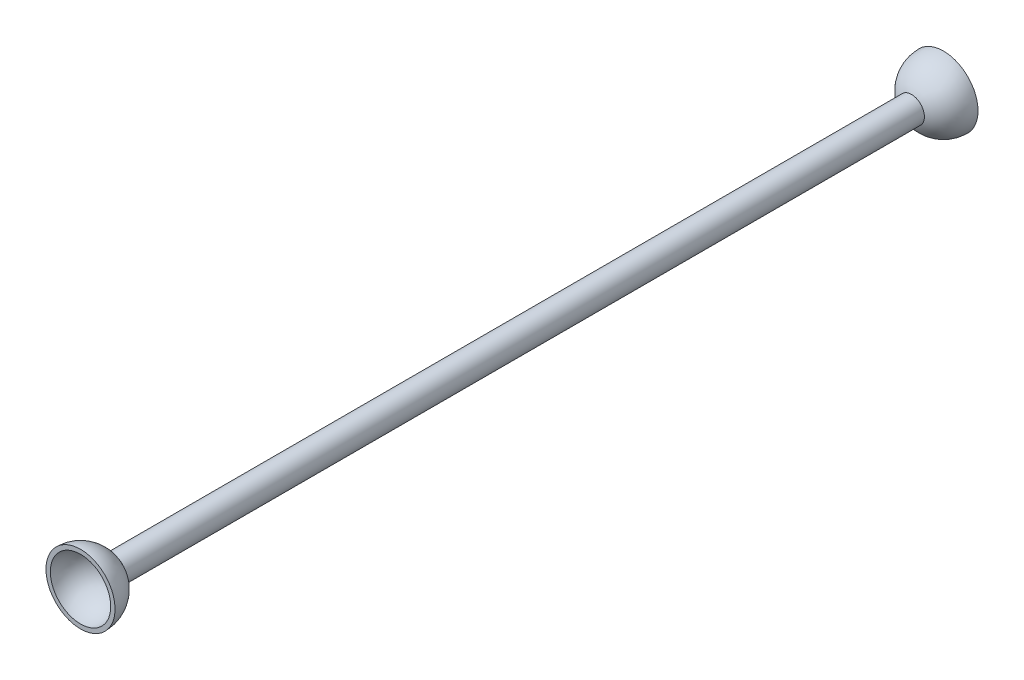
ISO-10303-21;
HEADER;
FILE_DESCRIPTION(('STEP AP214'),'2;1');
FILE_NAME('part.step','',(''),(''),'','','');
FILE_SCHEMA(('AUTOMOTIVE_DESIGN { 1 0 10303 214 1 1 1 1 }'));
ENDSEC;
DATA;
#1=APPLICATION_CONTEXT('core data for automotive mechanical design processes');
#2=APPLICATION_PROTOCOL_DEFINITION('international standard','automotive_design',2000,#1);
#3=PRODUCT_CONTEXT('',#1,'mechanical');
#4=PRODUCT('Part','Part','',(#3));
#5=PRODUCT_RELATED_PRODUCT_CATEGORY('part','',(#4));
#6=PRODUCT_DEFINITION_FORMATION('','',#4);
#7=PRODUCT_DEFINITION_CONTEXT('part definition',#1,'design');
#8=PRODUCT_DEFINITION('design','',#6,#7);
#9=PRODUCT_DEFINITION_SHAPE('','',#8);
#10=(LENGTH_UNIT() NAMED_UNIT(*) SI_UNIT(.MILLI.,.METRE.));
#11=(NAMED_UNIT(*) PLANE_ANGLE_UNIT() SI_UNIT($,.RADIAN.));
#12=(NAMED_UNIT(*) SI_UNIT($,.STERADIAN.) SOLID_ANGLE_UNIT());
#13=UNCERTAINTY_MEASURE_WITH_UNIT(LENGTH_MEASURE(1.E-05),#10,'distance_accuracy_value','');
#14=(GEOMETRIC_REPRESENTATION_CONTEXT(3) GLOBAL_UNCERTAINTY_ASSIGNED_CONTEXT((#13)) GLOBAL_UNIT_ASSIGNED_CONTEXT((#10,
#11,#12)) REPRESENTATION_CONTEXT('',''));
#15=CARTESIAN_POINT('',(0.,0.,0.));
#16=DIRECTION('',(0.,0.,1.));
#17=DIRECTION('',(1.,0.,0.));
#18=AXIS2_PLACEMENT_3D('',#15,#16,#17);
#19=CARTESIAN_POINT('',(0.,0.,200.));
#20=DIRECTION('',(0.,0.,-1.));
#21=DIRECTION('',(-1.,0.,0.));
#22=AXIS2_PLACEMENT_3D('',#19,#20,#21);
#23=CYLINDRICAL_SURFACE('',#22,3.);
#24=CARTESIAN_POINT('',(0.,0.,7.41619848709566));
#25=DIRECTION('',(0.,0.,-1.));
#26=DIRECTION('',(-1.,0.,0.));
#27=AXIS2_PLACEMENT_3D('',#24,#25,#26);
#28=CIRCLE('',#27,3.);
#29=CARTESIAN_POINT('',(-3.,0.,7.41619848709566));
#30=VERTEX_POINT('',#29);
#31=EDGE_CURVE('E48',#30,#30,#28,.F.);
#32=ORIENTED_EDGE('',*,*,#31,.T.);
#33=EDGE_LOOP('',(#32));
#34=FACE_BOUND('',#33,.T.);
#35=CARTESIAN_POINT('',(0.,0.,192.583801512904));
#36=DIRECTION('',(0.,0.,0.999999999999999));
#37=DIRECTION('',(1.,0.,0.));
#38=AXIS2_PLACEMENT_3D('',#35,#36,#37);
#39=CIRCLE('',#38,3.);
#40=CARTESIAN_POINT('',(3.,0.,192.583801512904));
#41=VERTEX_POINT('',#40);
#42=EDGE_CURVE('E10',#41,#41,#39,.F.);
#43=ORIENTED_EDGE('',*,*,#42,.T.);
#44=EDGE_LOOP('',(#43));
#45=FACE_BOUND('',#44,.T.);
#46=ADVANCED_FACE('F31',(#34,#45),#23,.T.);
#47=CARTESIAN_POINT('',(0.,0.,200.));
#48=DIRECTION('',(0.,-1.,0.));
#49=DIRECTION('',(1.,0.,0.));
#50=AXIS2_PLACEMENT_3D('',#47,#48,#49);
#51=SPHERICAL_SURFACE('',#50,8.);
#52=CARTESIAN_POINT('',(0.,0.,200.));
#53=DIRECTION('',(0.,0.,-1.));
#54=DIRECTION('',(-1.,0.,0.));
#55=AXIS2_PLACEMENT_3D('',#52,#53,#54);
#56=SPHERICAL_SURFACE('',#55,8.);
#57=CARTESIAN_POINT('',(0.,0.,200.));
#58=DIRECTION('',(0.,0.,-1.));
#59=DIRECTION('',(-1.,0.,0.));
#60=AXIS2_PLACEMENT_3D('',#57,#58,#59);
#61=CIRCLE('',#60,8.);
#62=CARTESIAN_POINT('',(-8.,0.,200.));
#63=VERTEX_POINT('',#62);
#64=EDGE_CURVE('E38',#63,#63,#61,.T.);
#65=ORIENTED_EDGE('',*,*,#64,.T.);
#66=EDGE_LOOP('',(#65));
#67=FACE_BOUND('',#66,.T.);
#68=ORIENTED_EDGE('',*,*,#42,.F.);
#69=EDGE_LOOP('',(#68));
#70=FACE_BOUND('',#69,.T.);
#71=ADVANCED_FACE('F74',(#67,#70),#56,.T.);
#72=CARTESIAN_POINT('',(0.,0.,200.));
#73=DIRECTION('',(0.,0.,1.));
#74=DIRECTION('',(1.,0.,0.));
#75=AXIS2_PLACEMENT_3D('',#72,#73,#74);
#76=PLANE('',#75);
#77=CARTESIAN_POINT('',(0.,0.,200.));
#78=DIRECTION('',(0.,0.,1.));
#79=DIRECTION('',(1.,0.,0.));
#80=AXIS2_PLACEMENT_3D('',#77,#78,#79);
#81=CIRCLE('',#80,7.);
#82=CARTESIAN_POINT('',(7.,0.,200.));
#83=VERTEX_POINT('',#82);
#84=EDGE_CURVE('E43',#83,#83,#81,.F.);
#85=ORIENTED_EDGE('',*,*,#84,.T.);
#86=EDGE_LOOP('',(#85));
#87=FACE_BOUND('',#86,.T.);
#88=ORIENTED_EDGE('',*,*,#64,.F.);
#89=EDGE_LOOP('',(#88));
#90=FACE_BOUND('',#89,.T.);
#91=ADVANCED_FACE('F78',(#87,#90),#76,.T.);
#92=CARTESIAN_POINT('',(0.,0.,200.));
#93=DIRECTION('',(0.,1.,0.));
#94=DIRECTION('',(1.,0.,0.));
#95=AXIS2_PLACEMENT_3D('',#92,#93,#94);
#96=SPHERICAL_SURFACE('',#95,7.);
#97=CARTESIAN_POINT('',(0.,0.,200.));
#98=DIRECTION('',(0.,0.,1.));
#99=DIRECTION('',(1.,0.,0.));
#100=AXIS2_PLACEMENT_3D('',#97,#98,#99);
#101=SPHERICAL_SURFACE('',#100,7.);
#102=ORIENTED_EDGE('',*,*,#84,.F.);
#103=EDGE_LOOP('',(#102));
#104=FACE_BOUND('',#103,.T.);
#105=ADVANCED_FACE('F70',(#104),#101,.F.);
#106=CARTESIAN_POINT('',(0.,0.,0.));
#107=DIRECTION('',(0.,-1.,0.));
#108=DIRECTION('',(-1.,0.,0.));
#109=AXIS2_PLACEMENT_3D('',#106,#107,#108);
#110=SPHERICAL_SURFACE('',#109,8.);
#111=CARTESIAN_POINT('',(0.,0.,0.));
#112=DIRECTION('',(0.,0.,1.));
#113=DIRECTION('',(1.,0.,0.));
#114=AXIS2_PLACEMENT_3D('',#111,#112,#113);
#115=SPHERICAL_SURFACE('',#114,8.);
#116=CARTESIAN_POINT('',(0.,0.,0.));
#117=DIRECTION('',(0.,0.,1.));
#118=DIRECTION('',(1.,0.,0.));
#119=AXIS2_PLACEMENT_3D('',#116,#117,#118);
#120=CIRCLE('',#119,8.);
#121=CARTESIAN_POINT('',(8.,0.,0.));
#122=VERTEX_POINT('',#121);
#123=EDGE_CURVE('E50',#122,#122,#120,.T.);
#124=ORIENTED_EDGE('',*,*,#123,.T.);
#125=EDGE_LOOP('',(#124));
#126=FACE_BOUND('',#125,.T.);
#127=ORIENTED_EDGE('',*,*,#31,.F.);
#128=EDGE_LOOP('',(#127));
#129=FACE_BOUND('',#128,.T.);
#130=ADVANCED_FACE('F64',(#126,#129),#115,.T.);
#131=CARTESIAN_POINT('',(0.,0.,0.));
#132=DIRECTION('',(0.,0.,1.));
#133=DIRECTION('',(1.,0.,0.));
#134=AXIS2_PLACEMENT_3D('',#131,#132,#133);
#135=PLANE('',#134);
#136=CARTESIAN_POINT('',(0.,0.,0.));
#137=DIRECTION('',(0.,0.,1.));
#138=DIRECTION('',(1.,0.,0.));
#139=AXIS2_PLACEMENT_3D('',#136,#137,#138);
#140=CIRCLE('',#139,7.);
#141=CARTESIAN_POINT('',(7.,0.,0.));
#142=VERTEX_POINT('',#141);
#143=EDGE_CURVE('E34',#142,#142,#140,.F.);
#144=ORIENTED_EDGE('',*,*,#143,.F.);
#145=EDGE_LOOP('',(#144));
#146=FACE_BOUND('',#145,.T.);
#147=ORIENTED_EDGE('',*,*,#123,.F.);
#148=EDGE_LOOP('',(#147));
#149=FACE_BOUND('',#148,.T.);
#150=ADVANCED_FACE('F61',(#146,#149),#135,.F.);
#151=CARTESIAN_POINT('',(0.,0.,0.));
#152=DIRECTION('',(0.,1.,0.));
#153=DIRECTION('',(-1.,0.,0.));
#154=AXIS2_PLACEMENT_3D('',#151,#152,#153);
#155=SPHERICAL_SURFACE('',#154,7.);
#156=CARTESIAN_POINT('',(0.,0.,0.));
#157=DIRECTION('',(0.,0.,1.));
#158=DIRECTION('',(1.,0.,0.));
#159=AXIS2_PLACEMENT_3D('',#156,#157,#158);
#160=SPHERICAL_SURFACE('',#159,7.);
#161=ORIENTED_EDGE('',*,*,#143,.T.);
#162=EDGE_LOOP('',(#161));
#163=FACE_BOUND('',#162,.T.);
#164=ADVANCED_FACE('F59',(#163),#160,.F.);
#165=CLOSED_SHELL('',(#46,#71,#91,#105,#130,#150,#164));
#166=MANIFOLD_SOLID_BREP('B2',#165);
#167=ADVANCED_BREP_SHAPE_REPRESENTATION('',(#18,#166),#14);
#168=SHAPE_DEFINITION_REPRESENTATION(#9,#167);
ENDSEC;
END-ISO-10303-21;
